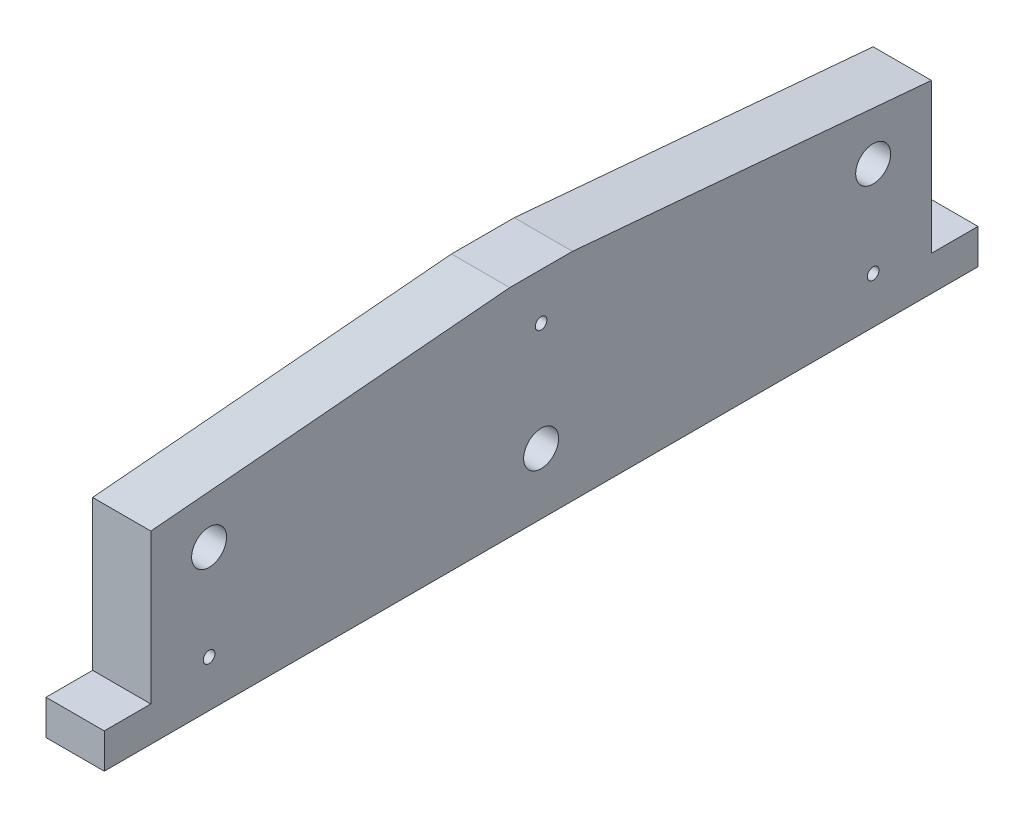
ISO-10303-21;
HEADER;
FILE_DESCRIPTION(('STEP AP214'),'2;1');
FILE_NAME('part.step','',(''),(''),'','','');
FILE_SCHEMA(('AUTOMOTIVE_DESIGN { 1 0 10303 214 1 1 1 1 }'));
ENDSEC;
DATA;
#1=APPLICATION_CONTEXT('core data for automotive mechanical design processes');
#2=APPLICATION_PROTOCOL_DEFINITION('international standard','automotive_design',2000,#1);
#3=PRODUCT_CONTEXT('',#1,'mechanical');
#4=PRODUCT('Part','Part','',(#3));
#5=PRODUCT_RELATED_PRODUCT_CATEGORY('part','',(#4));
#6=PRODUCT_DEFINITION_FORMATION('','',#4);
#7=PRODUCT_DEFINITION_CONTEXT('part definition',#1,'design');
#8=PRODUCT_DEFINITION('design','',#6,#7);
#9=PRODUCT_DEFINITION_SHAPE('','',#8);
#10=(LENGTH_UNIT() NAMED_UNIT(*) SI_UNIT(.MILLI.,.METRE.));
#11=(NAMED_UNIT(*) PLANE_ANGLE_UNIT() SI_UNIT($,.RADIAN.));
#12=(NAMED_UNIT(*) SI_UNIT($,.STERADIAN.) SOLID_ANGLE_UNIT());
#13=UNCERTAINTY_MEASURE_WITH_UNIT(LENGTH_MEASURE(1.E-05),#10,'distance_accuracy_value','');
#14=(GEOMETRIC_REPRESENTATION_CONTEXT(3) GLOBAL_UNCERTAINTY_ASSIGNED_CONTEXT((#13)) GLOBAL_UNIT_ASSIGNED_CONTEXT((#10,
#11,#12)) REPRESENTATION_CONTEXT('',''));
#15=CARTESIAN_POINT('',(0.,0.,0.));
#16=DIRECTION('',(0.,0.,1.));
#17=DIRECTION('',(1.,0.,0.));
#18=AXIS2_PLACEMENT_3D('',#15,#16,#17);
#19=CARTESIAN_POINT('',(10.,-37.489859630082,-75.));
#20=DIRECTION('',(0.,0.,1.));
#21=DIRECTION('',(1.,0.,0.));
#22=AXIS2_PLACEMENT_3D('',#19,#20,#21);
#23=PLANE('',#22);
#24=DIRECTION('',(0.,1.,0.));
#25=VECTOR('',#24,1.);
#26=CARTESIAN_POINT('',(0.,-37.489859630082,-75.));
#27=LINE('',#26,#25);
#28=CARTESIAN_POINT('',(0.,-37.489859630082,-75.));
#29=VERTEX_POINT('',#28);
#30=CARTESIAN_POINT('',(0.,-31.489859630082,-75.));
#31=VERTEX_POINT('',#30);
#32=EDGE_CURVE('E145',#29,#31,#27,.T.);
#33=ORIENTED_EDGE('',*,*,#32,.T.);
#34=DIRECTION('',(-1.,0.,0.));
#35=VECTOR('',#34,1.);
#36=CARTESIAN_POINT('',(10.,-31.489859630082,-75.));
#37=LINE('',#36,#35);
#38=CARTESIAN_POINT('',(10.,-31.489859630082,-75.));
#39=VERTEX_POINT('',#38);
#40=EDGE_CURVE('E11',#39,#31,#37,.T.);
#41=ORIENTED_EDGE('',*,*,#40,.F.);
#42=DIRECTION('',(0.,1.,0.));
#43=VECTOR('',#42,1.);
#44=CARTESIAN_POINT('',(10.,-37.489859630082,-75.));
#45=LINE('',#44,#43);
#46=CARTESIAN_POINT('',(10.,-37.489859630082,-75.));
#47=VERTEX_POINT('',#46);
#48=EDGE_CURVE('E165',#47,#39,#45,.T.);
#49=ORIENTED_EDGE('',*,*,#48,.F.);
#50=DIRECTION('',(-1.,0.,0.));
#51=VECTOR('',#50,1.);
#52=CARTESIAN_POINT('',(10.,-37.489859630082,-75.));
#53=LINE('',#52,#51);
#54=EDGE_CURVE('E141',#47,#29,#53,.T.);
#55=ORIENTED_EDGE('',*,*,#54,.T.);
#56=EDGE_LOOP('',(#33,#41,#49,#55));
#57=FACE_BOUND('',#56,.T.);
#58=ADVANCED_FACE('F37',(#57),#23,.F.);
#59=CARTESIAN_POINT('',(10.,-31.489859630082,-67.));
#60=DIRECTION('',(0.,-1.,0.));
#61=DIRECTION('',(0.,0.,-1.));
#62=AXIS2_PLACEMENT_3D('',#59,#60,#61);
#63=PLANE('',#62);
#64=DIRECTION('',(0.,0.,1.));
#65=VECTOR('',#64,1.);
#66=CARTESIAN_POINT('',(0.,-31.489859630082,-67.));
#67=LINE('',#66,#65);
#68=CARTESIAN_POINT('',(0.,-31.489859630082,-67.));
#69=VERTEX_POINT('',#68);
#70=EDGE_CURVE('E148',#31,#69,#67,.T.);
#71=ORIENTED_EDGE('',*,*,#70,.T.);
#72=DIRECTION('',(-1.,0.,0.));
#73=VECTOR('',#72,1.);
#74=CARTESIAN_POINT('',(10.,-31.489859630082,-67.));
#75=LINE('',#74,#73);
#76=CARTESIAN_POINT('',(10.,-31.489859630082,-67.));
#77=VERTEX_POINT('',#76);
#78=EDGE_CURVE('E45',#77,#69,#75,.T.);
#79=ORIENTED_EDGE('',*,*,#78,.F.);
#80=DIRECTION('',(0.,0.,1.));
#81=VECTOR('',#80,1.);
#82=CARTESIAN_POINT('',(10.,-31.489859630082,-67.));
#83=LINE('',#82,#81);
#84=EDGE_CURVE('E102',#39,#77,#83,.T.);
#85=ORIENTED_EDGE('',*,*,#84,.F.);
#86=ORIENTED_EDGE('',*,*,#40,.T.);
#87=EDGE_LOOP('',(#71,#79,#85,#86));
#88=FACE_BOUND('',#87,.T.);
#89=ADVANCED_FACE('F283',(#88),#63,.F.);
#90=CARTESIAN_POINT('',(10.,-5.78068756512548,-67.));
#91=DIRECTION('',(0.,0.,1.));
#92=DIRECTION('',(1.,0.,0.));
#93=AXIS2_PLACEMENT_3D('',#90,#91,#92);
#94=PLANE('',#93);
#95=DIRECTION('',(0.,1.,0.));
#96=VECTOR('',#95,1.);
#97=CARTESIAN_POINT('',(0.,-5.78068756512548,-67.));
#98=LINE('',#97,#96);
#99=CARTESIAN_POINT('',(0.,-5.78068756512548,-67.));
#100=VERTEX_POINT('',#99);
#101=EDGE_CURVE('E151',#69,#100,#98,.T.);
#102=ORIENTED_EDGE('',*,*,#101,.T.);
#103=DIRECTION('',(-1.,0.,0.));
#104=VECTOR('',#103,1.);
#105=CARTESIAN_POINT('',(10.,-5.78068756512548,-67.));
#106=LINE('',#105,#104);
#107=CARTESIAN_POINT('',(10.,-5.78068756512548,-67.));
#108=VERTEX_POINT('',#107);
#109=EDGE_CURVE('E178',#108,#100,#106,.T.);
#110=ORIENTED_EDGE('',*,*,#109,.F.);
#111=DIRECTION('',(0.,1.,0.));
#112=VECTOR('',#111,1.);
#113=CARTESIAN_POINT('',(10.,-5.78068756512548,-67.));
#114=LINE('',#113,#112);
#115=EDGE_CURVE('E186',#77,#108,#114,.T.);
#116=ORIENTED_EDGE('',*,*,#115,.F.);
#117=ORIENTED_EDGE('',*,*,#78,.T.);
#118=EDGE_LOOP('',(#102,#110,#116,#117));
#119=FACE_BOUND('',#118,.T.);
#120=ADVANCED_FACE('F184',(#119),#94,.F.);
#121=CARTESIAN_POINT('',(10.,-0.390585164422767,-5.39084764272872));
#122=DIRECTION('',(0.,-0.996194698091746,0.0871557427476585));
#123=DIRECTION('',(0.,-0.0871557427476585,-0.996194698091746));
#124=AXIS2_PLACEMENT_3D('',#121,#122,#123);
#125=PLANE('',#124);
#126=DIRECTION('',(0.,0.0871557427476585,0.996194698091745));
#127=VECTOR('',#126,1.);
#128=CARTESIAN_POINT('',(0.,-0.390585164422767,-5.39084764272872));
#129=LINE('',#128,#127);
#130=CARTESIAN_POINT('',(0.,-0.390585164422767,-5.39084764272872));
#131=VERTEX_POINT('',#130);
#132=EDGE_CURVE('E153',#100,#131,#129,.T.);
#133=ORIENTED_EDGE('',*,*,#132,.T.);
#134=DIRECTION('',(-1.,0.,0.));
#135=VECTOR('',#134,1.);
#136=CARTESIAN_POINT('',(10.,-0.390585164422767,-5.39084764272872));
#137=LINE('',#136,#135);
#138=CARTESIAN_POINT('',(10.,-0.390585164422767,-5.39084764272872));
#139=VERTEX_POINT('',#138);
#140=EDGE_CURVE('E175',#139,#131,#137,.T.);
#141=ORIENTED_EDGE('',*,*,#140,.F.);
#142=DIRECTION('',(0.,0.0871557427476585,0.996194698091745));
#143=VECTOR('',#142,1.);
#144=CARTESIAN_POINT('',(10.,-0.390585164422767,-5.39084764272872));
#145=LINE('',#144,#143);
#146=EDGE_CURVE('E203',#108,#139,#145,.T.);
#147=ORIENTED_EDGE('',*,*,#146,.F.);
#148=ORIENTED_EDGE('',*,*,#109,.T.);
#149=EDGE_LOOP('',(#133,#141,#147,#148));
#150=FACE_BOUND('',#149,.T.);
#151=ADVANCED_FACE('F194',(#150),#125,.F.);
#152=CARTESIAN_POINT('',(10.,-0.390585164422769,5.39084764272872));
#153=DIRECTION('',(0.,-1.,0.));
#154=DIRECTION('',(0.,0.,-1.));
#155=AXIS2_PLACEMENT_3D('',#152,#153,#154);
#156=PLANE('',#155);
#157=DIRECTION('',(0.,0.,1.));
#158=VECTOR('',#157,1.);
#159=CARTESIAN_POINT('',(0.,-0.390585164422769,5.39084764272872));
#160=LINE('',#159,#158);
#161=CARTESIAN_POINT('',(0.,-0.390585164422769,5.39084764272872));
#162=VERTEX_POINT('',#161);
#163=EDGE_CURVE('E156',#131,#162,#160,.T.);
#164=ORIENTED_EDGE('',*,*,#163,.T.);
#165=DIRECTION('',(-1.,0.,0.));
#166=VECTOR('',#165,1.);
#167=CARTESIAN_POINT('',(10.,-0.390585164422769,5.39084764272872));
#168=LINE('',#167,#166);
#169=CARTESIAN_POINT('',(10.,-0.390585164422769,5.39084764272872));
#170=VERTEX_POINT('',#169);
#171=EDGE_CURVE('E172',#170,#162,#168,.T.);
#172=ORIENTED_EDGE('',*,*,#171,.F.);
#173=DIRECTION('',(0.,0.,1.));
#174=VECTOR('',#173,1.);
#175=CARTESIAN_POINT('',(10.,-0.390585164422767,-5.39084764272872));
#176=LINE('',#175,#174);
#177=EDGE_CURVE('E200',#139,#170,#176,.T.);
#178=ORIENTED_EDGE('',*,*,#177,.F.);
#179=ORIENTED_EDGE('',*,*,#140,.T.);
#180=EDGE_LOOP('',(#164,#172,#178,#179));
#181=FACE_BOUND('',#180,.T.);
#182=ADVANCED_FACE('F198',(#181),#156,.F.);
#183=CARTESIAN_POINT('',(10.,-0.390585164422769,5.39084764272872));
#184=DIRECTION('',(0.,-0.996194698091746,-0.0871557427476588));
#185=DIRECTION('',(0.,0.0871557427476588,-0.996194698091746));
#186=AXIS2_PLACEMENT_3D('',#183,#184,#185);
#187=PLANE('',#186);
#188=DIRECTION('',(0.,-0.0871557427476587,0.996194698091745));
#189=VECTOR('',#188,1.);
#190=CARTESIAN_POINT('',(0.,-0.390585164422769,5.39084764272872));
#191=LINE('',#190,#189);
#192=CARTESIAN_POINT('',(0.,-5.7806875651255,67.));
#193=VERTEX_POINT('',#192);
#194=EDGE_CURVE('E158',#162,#193,#191,.T.);
#195=ORIENTED_EDGE('',*,*,#194,.T.);
#196=DIRECTION('',(-1.,0.,0.));
#197=VECTOR('',#196,1.);
#198=CARTESIAN_POINT('',(10.,-5.7806875651255,67.));
#199=LINE('',#198,#197);
#200=CARTESIAN_POINT('',(10.,-5.7806875651255,67.));
#201=VERTEX_POINT('',#200);
#202=EDGE_CURVE('E169',#201,#193,#199,.T.);
#203=ORIENTED_EDGE('',*,*,#202,.F.);
#204=DIRECTION('',(0.,-0.0871557427476587,0.996194698091745));
#205=VECTOR('',#204,1.);
#206=CARTESIAN_POINT('',(10.,-0.390585164422769,5.39084764272872));
#207=LINE('',#206,#205);
#208=EDGE_CURVE('E202',#170,#201,#207,.T.);
#209=ORIENTED_EDGE('',*,*,#208,.F.);
#210=ORIENTED_EDGE('',*,*,#171,.T.);
#211=EDGE_LOOP('',(#195,#203,#209,#210));
#212=FACE_BOUND('',#211,.T.);
#213=ADVANCED_FACE('F295',(#212),#187,.F.);
#214=CARTESIAN_POINT('',(10.,-5.7806875651255,67.));
#215=DIRECTION('',(0.,0.,-1.));
#216=DIRECTION('',(-1.,0.,0.));
#217=AXIS2_PLACEMENT_3D('',#214,#215,#216);
#218=PLANE('',#217);
#219=DIRECTION('',(0.,-1.,0.));
#220=VECTOR('',#219,1.);
#221=CARTESIAN_POINT('',(0.,-5.7806875651255,67.));
#222=LINE('',#221,#220);
#223=CARTESIAN_POINT('',(0.,-31.489859630082,67.));
#224=VERTEX_POINT('',#223);
#225=EDGE_CURVE('E160',#193,#224,#222,.T.);
#226=ORIENTED_EDGE('',*,*,#225,.T.);
#227=DIRECTION('',(-1.,0.,0.));
#228=VECTOR('',#227,1.);
#229=CARTESIAN_POINT('',(10.,-31.489859630082,67.));
#230=LINE('',#229,#228);
#231=CARTESIAN_POINT('',(10.,-31.489859630082,67.));
#232=VERTEX_POINT('',#231);
#233=EDGE_CURVE('E136',#232,#224,#230,.T.);
#234=ORIENTED_EDGE('',*,*,#233,.F.);
#235=DIRECTION('',(0.,-1.,0.));
#236=VECTOR('',#235,1.);
#237=CARTESIAN_POINT('',(10.,-5.7806875651255,67.));
#238=LINE('',#237,#236);
#239=EDGE_CURVE('E127',#201,#232,#238,.T.);
#240=ORIENTED_EDGE('',*,*,#239,.F.);
#241=ORIENTED_EDGE('',*,*,#202,.T.);
#242=EDGE_LOOP('',(#226,#234,#240,#241));
#243=FACE_BOUND('',#242,.T.);
#244=ADVANCED_FACE('F292',(#243),#218,.F.);
#245=CARTESIAN_POINT('',(10.,-31.489859630082,75.));
#246=DIRECTION('',(0.,-1.,0.));
#247=DIRECTION('',(0.,0.,-1.));
#248=AXIS2_PLACEMENT_3D('',#245,#246,#247);
#249=PLANE('',#248);
#250=DIRECTION('',(0.,0.,1.));
#251=VECTOR('',#250,1.);
#252=CARTESIAN_POINT('',(0.,-31.489859630082,75.));
#253=LINE('',#252,#251);
#254=CARTESIAN_POINT('',(0.,-31.489859630082,75.));
#255=VERTEX_POINT('',#254);
#256=EDGE_CURVE('E135',#224,#255,#253,.T.);
#257=ORIENTED_EDGE('',*,*,#256,.T.);
#258=DIRECTION('',(-1.,0.,0.));
#259=VECTOR('',#258,1.);
#260=CARTESIAN_POINT('',(10.,-31.489859630082,75.));
#261=LINE('',#260,#259);
#262=CARTESIAN_POINT('',(10.,-31.489859630082,75.));
#263=VERTEX_POINT('',#262);
#264=EDGE_CURVE('E132',#263,#255,#261,.T.);
#265=ORIENTED_EDGE('',*,*,#264,.F.);
#266=DIRECTION('',(0.,0.,1.));
#267=VECTOR('',#266,1.);
#268=CARTESIAN_POINT('',(10.,-31.489859630082,75.));
#269=LINE('',#268,#267);
#270=EDGE_CURVE('E121',#232,#263,#269,.T.);
#271=ORIENTED_EDGE('',*,*,#270,.F.);
#272=ORIENTED_EDGE('',*,*,#233,.T.);
#273=EDGE_LOOP('',(#257,#265,#271,#272));
#274=FACE_BOUND('',#273,.T.);
#275=ADVANCED_FACE('F133',(#274),#249,.F.);
#276=CARTESIAN_POINT('',(10.,-37.489859630082,75.));
#277=DIRECTION('',(0.,0.,-1.));
#278=DIRECTION('',(-1.,0.,0.));
#279=AXIS2_PLACEMENT_3D('',#276,#277,#278);
#280=PLANE('',#279);
#281=DIRECTION('',(0.,-1.,0.));
#282=VECTOR('',#281,1.);
#283=CARTESIAN_POINT('',(0.,-37.489859630082,75.));
#284=LINE('',#283,#282);
#285=CARTESIAN_POINT('',(0.,-37.489859630082,75.));
#286=VERTEX_POINT('',#285);
#287=EDGE_CURVE('E88',#255,#286,#284,.T.);
#288=ORIENTED_EDGE('',*,*,#287,.T.);
#289=DIRECTION('',(-1.,0.,0.));
#290=VECTOR('',#289,1.);
#291=CARTESIAN_POINT('',(10.,-37.489859630082,75.));
#292=LINE('',#291,#290);
#293=CARTESIAN_POINT('',(10.,-37.489859630082,75.));
#294=VERTEX_POINT('',#293);
#295=EDGE_CURVE('E137',#294,#286,#292,.T.);
#296=ORIENTED_EDGE('',*,*,#295,.F.);
#297=DIRECTION('',(0.,-1.,0.));
#298=VECTOR('',#297,1.);
#299=CARTESIAN_POINT('',(10.,-37.489859630082,75.));
#300=LINE('',#299,#298);
#301=EDGE_CURVE('E125',#263,#294,#300,.T.);
#302=ORIENTED_EDGE('',*,*,#301,.F.);
#303=ORIENTED_EDGE('',*,*,#264,.T.);
#304=EDGE_LOOP('',(#288,#296,#302,#303));
#305=FACE_BOUND('',#304,.T.);
#306=ADVANCED_FACE('F139',(#305),#280,.F.);
#307=CARTESIAN_POINT('',(10.,-37.489859630082,75.));
#308=DIRECTION('',(0.,1.,0.));
#309=DIRECTION('',(0.,0.,1.));
#310=AXIS2_PLACEMENT_3D('',#307,#308,#309);
#311=PLANE('',#310);
#312=DIRECTION('',(0.,0.,-1.));
#313=VECTOR('',#312,1.);
#314=CARTESIAN_POINT('',(0.,-37.489859630082,75.));
#315=LINE('',#314,#313);
#316=EDGE_CURVE('E94',#286,#29,#315,.T.);
#317=ORIENTED_EDGE('',*,*,#316,.T.);
#318=ORIENTED_EDGE('',*,*,#54,.F.);
#319=DIRECTION('',(0.,0.,-1.));
#320=VECTOR('',#319,1.);
#321=CARTESIAN_POINT('',(10.,-37.489859630082,75.));
#322=LINE('',#321,#320);
#323=EDGE_CURVE('E53',#294,#47,#322,.T.);
#324=ORIENTED_EDGE('',*,*,#323,.F.);
#325=ORIENTED_EDGE('',*,*,#295,.T.);
#326=EDGE_LOOP('',(#317,#318,#324,#325));
#327=FACE_BOUND('',#326,.T.);
#328=ADVANCED_FACE('F338',(#327),#311,.F.);
#329=CARTESIAN_POINT('',(10.,0.,0.));
#330=DIRECTION('',(-1.,0.,0.));
#331=DIRECTION('',(0.,0.,1.));
#332=AXIS2_PLACEMENT_3D('',#329,#330,#331);
#333=PLANE('',#332);
#334=CARTESIAN_POINT('',(10.,-13.1787703967768,57.));
#335=DIRECTION('',(-1.,0.,0.));
#336=DIRECTION('',(0.,0.,1.));
#337=AXIS2_PLACEMENT_3D('',#334,#335,#336);
#338=CIRCLE('',#337,3.);
#339=CARTESIAN_POINT('',(10.,-13.1787703967768,60.));
#340=VERTEX_POINT('',#339);
#341=EDGE_CURVE('E238',#340,#340,#338,.T.);
#342=ORIENTED_EDGE('',*,*,#341,.T.);
#343=EDGE_LOOP('',(#342));
#344=FACE_BOUND('',#343,.T.);
#345=CARTESIAN_POINT('',(10.,-13.1787703967768,-57.));
#346=DIRECTION('',(-1.,0.,0.));
#347=DIRECTION('',(0.,0.,1.));
#348=AXIS2_PLACEMENT_3D('',#345,#346,#347);
#349=CIRCLE('',#348,3.);
#350=CARTESIAN_POINT('',(10.,-13.1787703967768,-54.));
#351=VERTEX_POINT('',#350);
#352=EDGE_CURVE('E232',#351,#351,#349,.T.);
#353=ORIENTED_EDGE('',*,*,#352,.T.);
#354=EDGE_LOOP('',(#353));
#355=FACE_BOUND('',#354,.T.);
#356=CARTESIAN_POINT('',(10.,-27.0028433510188,0.));
#357=DIRECTION('',(-1.,0.,0.));
#358=DIRECTION('',(0.,0.,1.));
#359=AXIS2_PLACEMENT_3D('',#356,#357,#358);
#360=CIRCLE('',#359,3.);
#361=CARTESIAN_POINT('',(10.,-27.0028433510188,3.));
#362=VERTEX_POINT('',#361);
#363=EDGE_CURVE('E226',#362,#362,#360,.T.);
#364=ORIENTED_EDGE('',*,*,#363,.T.);
#365=EDGE_LOOP('',(#364));
#366=FACE_BOUND('',#365,.T.);
#367=CARTESIAN_POINT('',(10.,-8.39058516442278,0.));
#368=DIRECTION('',(-1.,0.,0.));
#369=DIRECTION('',(0.,0.,1.));
#370=AXIS2_PLACEMENT_3D('',#367,#368,#369);
#371=CIRCLE('',#370,1.);
#372=CARTESIAN_POINT('',(10.,-8.39058516442278,1.));
#373=VERTEX_POINT('',#372);
#374=EDGE_CURVE('E220',#373,#373,#371,.T.);
#375=ORIENTED_EDGE('',*,*,#374,.T.);
#376=EDGE_LOOP('',(#375));
#377=FACE_BOUND('',#376,.T.);
#378=CARTESIAN_POINT('',(10.,-29.4898596300819,57.));
#379=DIRECTION('',(-1.,0.,0.));
#380=DIRECTION('',(0.,0.,-1.));
#381=AXIS2_PLACEMENT_3D('',#378,#379,#380);
#382=CIRCLE('',#381,0.999999999999998);
#383=CARTESIAN_POINT('',(10.,-29.4898596300819,56.));
#384=VERTEX_POINT('',#383);
#385=EDGE_CURVE('E214',#384,#384,#382,.T.);
#386=ORIENTED_EDGE('',*,*,#385,.T.);
#387=EDGE_LOOP('',(#386));
#388=FACE_BOUND('',#387,.T.);
#389=CARTESIAN_POINT('',(10.,-29.489859630082,-57.));
#390=DIRECTION('',(-1.,0.,0.));
#391=DIRECTION('',(0.,0.,1.));
#392=AXIS2_PLACEMENT_3D('',#389,#390,#391);
#393=CIRCLE('',#392,0.999999999999998);
#394=CARTESIAN_POINT('',(10.,-29.489859630082,-56.));
#395=VERTEX_POINT('',#394);
#396=EDGE_CURVE('E149',#395,#395,#393,.T.);
#397=ORIENTED_EDGE('',*,*,#396,.T.);
#398=EDGE_LOOP('',(#397));
#399=FACE_BOUND('',#398,.T.);
#400=ORIENTED_EDGE('',*,*,#48,.T.);
#401=ORIENTED_EDGE('',*,*,#84,.T.);
#402=ORIENTED_EDGE('',*,*,#115,.T.);
#403=ORIENTED_EDGE('',*,*,#146,.T.);
#404=ORIENTED_EDGE('',*,*,#177,.T.);
#405=ORIENTED_EDGE('',*,*,#208,.T.);
#406=ORIENTED_EDGE('',*,*,#239,.T.);
#407=ORIENTED_EDGE('',*,*,#270,.T.);
#408=ORIENTED_EDGE('',*,*,#301,.T.);
#409=ORIENTED_EDGE('',*,*,#323,.T.);
#410=EDGE_LOOP('',(#400,#401,#402,#403,#404,#405,#406,#407,#408,#409));
#411=FACE_BOUND('',#410,.T.);
#412=ADVANCED_FACE('F123',(#344,#355,#366,#377,#388,#399,#411),#333,.F.);
#413=CARTESIAN_POINT('',(0.,0.,0.));
#414=DIRECTION('',(-1.,0.,0.));
#415=DIRECTION('',(0.,0.,1.));
#416=AXIS2_PLACEMENT_3D('',#413,#414,#415);
#417=PLANE('',#416);
#418=CARTESIAN_POINT('',(0.,-13.1787703967768,57.));
#419=DIRECTION('',(-1.,0.,0.));
#420=DIRECTION('',(0.,0.,1.));
#421=AXIS2_PLACEMENT_3D('',#418,#419,#420);
#422=CIRCLE('',#421,3.);
#423=CARTESIAN_POINT('',(0.,-13.1787703967768,60.));
#424=VERTEX_POINT('',#423);
#425=EDGE_CURVE('E241',#424,#424,#422,.T.);
#426=ORIENTED_EDGE('',*,*,#425,.F.);
#427=EDGE_LOOP('',(#426));
#428=FACE_BOUND('',#427,.T.);
#429=CARTESIAN_POINT('',(0.,-13.1787703967768,-57.));
#430=DIRECTION('',(-1.,0.,0.));
#431=DIRECTION('',(0.,0.,1.));
#432=AXIS2_PLACEMENT_3D('',#429,#430,#431);
#433=CIRCLE('',#432,3.);
#434=CARTESIAN_POINT('',(0.,-13.1787703967768,-54.));
#435=VERTEX_POINT('',#434);
#436=EDGE_CURVE('E235',#435,#435,#433,.T.);
#437=ORIENTED_EDGE('',*,*,#436,.F.);
#438=EDGE_LOOP('',(#437));
#439=FACE_BOUND('',#438,.T.);
#440=CARTESIAN_POINT('',(0.,-27.0028433510188,0.));
#441=DIRECTION('',(-1.,0.,0.));
#442=DIRECTION('',(0.,0.,1.));
#443=AXIS2_PLACEMENT_3D('',#440,#441,#442);
#444=CIRCLE('',#443,3.);
#445=CARTESIAN_POINT('',(0.,-27.0028433510188,3.));
#446=VERTEX_POINT('',#445);
#447=EDGE_CURVE('E229',#446,#446,#444,.T.);
#448=ORIENTED_EDGE('',*,*,#447,.F.);
#449=EDGE_LOOP('',(#448));
#450=FACE_BOUND('',#449,.T.);
#451=CARTESIAN_POINT('',(0.,-8.39058516442278,0.));
#452=DIRECTION('',(-1.,0.,0.));
#453=DIRECTION('',(0.,0.,1.));
#454=AXIS2_PLACEMENT_3D('',#451,#452,#453);
#455=CIRCLE('',#454,1.);
#456=CARTESIAN_POINT('',(0.,-8.39058516442278,1.));
#457=VERTEX_POINT('',#456);
#458=EDGE_CURVE('E223',#457,#457,#455,.T.);
#459=ORIENTED_EDGE('',*,*,#458,.F.);
#460=EDGE_LOOP('',(#459));
#461=FACE_BOUND('',#460,.T.);
#462=CARTESIAN_POINT('',(0.,-29.4898596300819,57.));
#463=DIRECTION('',(-1.,0.,0.));
#464=DIRECTION('',(0.,0.,-1.));
#465=AXIS2_PLACEMENT_3D('',#462,#463,#464);
#466=CIRCLE('',#465,0.999999999999998);
#467=CARTESIAN_POINT('',(0.,-29.4898596300819,56.));
#468=VERTEX_POINT('',#467);
#469=EDGE_CURVE('E217',#468,#468,#466,.T.);
#470=ORIENTED_EDGE('',*,*,#469,.F.);
#471=EDGE_LOOP('',(#470));
#472=FACE_BOUND('',#471,.T.);
#473=CARTESIAN_POINT('',(0.,-29.489859630082,-57.));
#474=DIRECTION('',(-1.,0.,0.));
#475=DIRECTION('',(0.,0.,1.));
#476=AXIS2_PLACEMENT_3D('',#473,#474,#475);
#477=CIRCLE('',#476,0.999999999999998);
#478=CARTESIAN_POINT('',(0.,-29.489859630082,-56.));
#479=VERTEX_POINT('',#478);
#480=EDGE_CURVE('E211',#479,#479,#477,.T.);
#481=ORIENTED_EDGE('',*,*,#480,.F.);
#482=EDGE_LOOP('',(#481));
#483=FACE_BOUND('',#482,.T.);
#484=ORIENTED_EDGE('',*,*,#32,.F.);
#485=ORIENTED_EDGE('',*,*,#316,.F.);
#486=ORIENTED_EDGE('',*,*,#287,.F.);
#487=ORIENTED_EDGE('',*,*,#256,.F.);
#488=ORIENTED_EDGE('',*,*,#225,.F.);
#489=ORIENTED_EDGE('',*,*,#194,.F.);
#490=ORIENTED_EDGE('',*,*,#163,.F.);
#491=ORIENTED_EDGE('',*,*,#132,.F.);
#492=ORIENTED_EDGE('',*,*,#101,.F.);
#493=ORIENTED_EDGE('',*,*,#70,.F.);
#494=EDGE_LOOP('',(#484,#485,#486,#487,#488,#489,#490,#491,#492,#493));
#495=FACE_BOUND('',#494,.T.);
#496=ADVANCED_FACE('F190',(#428,#439,#450,#461,#472,#483,#495),#417,.T.);
#497=CARTESIAN_POINT('',(10.,-29.489859630082,-57.));
#498=DIRECTION('',(-1.,0.,0.));
#499=DIRECTION('',(0.,0.,1.));
#500=AXIS2_PLACEMENT_3D('',#497,#498,#499);
#501=CYLINDRICAL_SURFACE('',#500,0.999999999999998);
#502=ORIENTED_EDGE('',*,*,#396,.F.);
#503=EDGE_LOOP('',(#502));
#504=FACE_BOUND('',#503,.T.);
#505=ORIENTED_EDGE('',*,*,#480,.T.);
#506=EDGE_LOOP('',(#505));
#507=FACE_BOUND('',#506,.T.);
#508=ADVANCED_FACE('F258',(#504,#507),#501,.F.);
#509=CARTESIAN_POINT('',(10.,-29.4898596300819,57.));
#510=DIRECTION('',(-1.,0.,0.));
#511=DIRECTION('',(0.,0.,1.));
#512=AXIS2_PLACEMENT_3D('',#509,#510,#511);
#513=CYLINDRICAL_SURFACE('',#512,0.999999999999998);
#514=ORIENTED_EDGE('',*,*,#385,.F.);
#515=EDGE_LOOP('',(#514));
#516=FACE_BOUND('',#515,.T.);
#517=ORIENTED_EDGE('',*,*,#469,.T.);
#518=EDGE_LOOP('',(#517));
#519=FACE_BOUND('',#518,.T.);
#520=ADVANCED_FACE('F271',(#516,#519),#513,.F.);
#521=CARTESIAN_POINT('',(10.,-8.39058516442278,0.));
#522=DIRECTION('',(-1.,0.,0.));
#523=DIRECTION('',(0.,0.,1.));
#524=AXIS2_PLACEMENT_3D('',#521,#522,#523);
#525=CYLINDRICAL_SURFACE('',#524,1.);
#526=ORIENTED_EDGE('',*,*,#374,.F.);
#527=EDGE_LOOP('',(#526));
#528=FACE_BOUND('',#527,.T.);
#529=ORIENTED_EDGE('',*,*,#458,.T.);
#530=EDGE_LOOP('',(#529));
#531=FACE_BOUND('',#530,.T.);
#532=ADVANCED_FACE('F277',(#528,#531),#525,.F.);
#533=CARTESIAN_POINT('',(10.,-27.0028433510188,0.));
#534=DIRECTION('',(-1.,0.,0.));
#535=DIRECTION('',(0.,0.,1.));
#536=AXIS2_PLACEMENT_3D('',#533,#534,#535);
#537=CYLINDRICAL_SURFACE('',#536,3.);
#538=ORIENTED_EDGE('',*,*,#363,.F.);
#539=EDGE_LOOP('',(#538));
#540=FACE_BOUND('',#539,.T.);
#541=ORIENTED_EDGE('',*,*,#447,.T.);
#542=EDGE_LOOP('',(#541));
#543=FACE_BOUND('',#542,.T.);
#544=ADVANCED_FACE('F366',(#540,#543),#537,.F.);
#545=CARTESIAN_POINT('',(10.,-13.1787703967768,-57.));
#546=DIRECTION('',(-1.,0.,0.));
#547=DIRECTION('',(0.,0.,1.));
#548=AXIS2_PLACEMENT_3D('',#545,#546,#547);
#549=CYLINDRICAL_SURFACE('',#548,3.);
#550=ORIENTED_EDGE('',*,*,#352,.F.);
#551=EDGE_LOOP('',(#550));
#552=FACE_BOUND('',#551,.T.);
#553=ORIENTED_EDGE('',*,*,#436,.T.);
#554=EDGE_LOOP('',(#553));
#555=FACE_BOUND('',#554,.T.);
#556=ADVANCED_FACE('F252',(#552,#555),#549,.F.);
#557=CARTESIAN_POINT('',(10.,-13.1787703967768,57.));
#558=DIRECTION('',(-1.,0.,0.));
#559=DIRECTION('',(0.,0.,1.));
#560=AXIS2_PLACEMENT_3D('',#557,#558,#559);
#561=CYLINDRICAL_SURFACE('',#560,3.);
#562=ORIENTED_EDGE('',*,*,#341,.F.);
#563=EDGE_LOOP('',(#562));
#564=FACE_BOUND('',#563,.T.);
#565=ORIENTED_EDGE('',*,*,#425,.T.);
#566=EDGE_LOOP('',(#565));
#567=FACE_BOUND('',#566,.T.);
#568=ADVANCED_FACE('F249',(#564,#567),#561,.F.);
#569=CLOSED_SHELL('',(#58,#89,#120,#151,#182,#213,#244,#275,#306,#328,#412,#496,#508,#520,#532,
#544,#556,#568));
#570=MANIFOLD_SOLID_BREP('B2',#569);
#571=ADVANCED_BREP_SHAPE_REPRESENTATION('',(#18,#570),#14);
#572=SHAPE_DEFINITION_REPRESENTATION(#9,#571);
ENDSEC;
END-ISO-10303-21;
